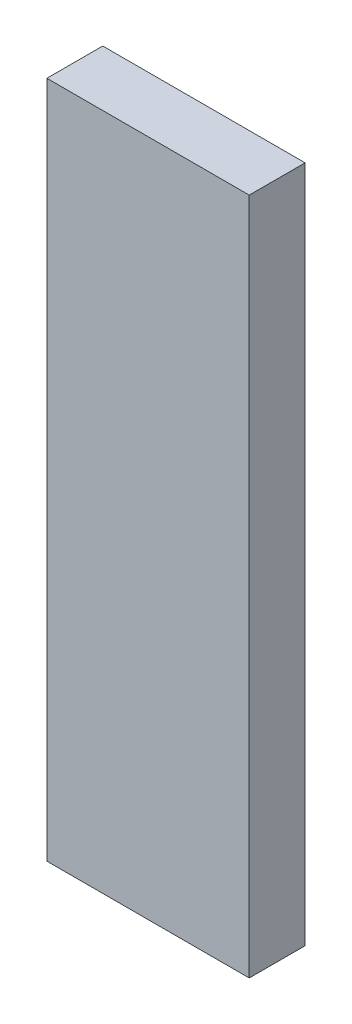
ISO-10303-21;
HEADER;
FILE_DESCRIPTION(('STEP AP214'),'2;1');
FILE_NAME('part.step','',(''),(''),'','','');
FILE_SCHEMA(('AUTOMOTIVE_DESIGN { 1 0 10303 214 1 1 1 1 }'));
ENDSEC;
DATA;
#1=APPLICATION_CONTEXT('core data for automotive mechanical design processes');
#2=APPLICATION_PROTOCOL_DEFINITION('international standard','automotive_design',2000,#1);
#3=PRODUCT_CONTEXT('',#1,'mechanical');
#4=PRODUCT('Part','Part','',(#3));
#5=PRODUCT_RELATED_PRODUCT_CATEGORY('part','',(#4));
#6=PRODUCT_DEFINITION_FORMATION('','',#4);
#7=PRODUCT_DEFINITION_CONTEXT('part definition',#1,'design');
#8=PRODUCT_DEFINITION('design','',#6,#7);
#9=PRODUCT_DEFINITION_SHAPE('','',#8);
#10=(LENGTH_UNIT() NAMED_UNIT(*) SI_UNIT(.MILLI.,.METRE.));
#11=(NAMED_UNIT(*) PLANE_ANGLE_UNIT() SI_UNIT($,.RADIAN.));
#12=(NAMED_UNIT(*) SI_UNIT($,.STERADIAN.) SOLID_ANGLE_UNIT());
#13=UNCERTAINTY_MEASURE_WITH_UNIT(LENGTH_MEASURE(1.E-05),#10,'distance_accuracy_value','');
#14=(GEOMETRIC_REPRESENTATION_CONTEXT(3) GLOBAL_UNCERTAINTY_ASSIGNED_CONTEXT((#13)) GLOBAL_UNIT_ASSIGNED_CONTEXT((#10,
#11,#12)) REPRESENTATION_CONTEXT('',''));
#15=CARTESIAN_POINT('',(0.,0.,0.));
#16=DIRECTION('',(0.,0.,1.));
#17=DIRECTION('',(1.,0.,0.));
#18=AXIS2_PLACEMENT_3D('',#15,#16,#17);
#19=CARTESIAN_POINT('',(-1.7018,-5.7023,0.9398));
#20=DIRECTION('',(1.,0.,0.));
#21=DIRECTION('',(0.,1.,0.));
#22=AXIS2_PLACEMENT_3D('',#19,#20,#21);
#23=PLANE('',#22);
#24=DIRECTION('',(0.,-1.,0.));
#25=VECTOR('',#24,1.);
#26=CARTESIAN_POINT('',(-1.7018,-5.7023,0.));
#27=LINE('',#26,#25);
#28=CARTESIAN_POINT('',(-1.7018,5.7023,0.));
#29=VERTEX_POINT('',#28);
#30=CARTESIAN_POINT('',(-1.7018,-5.7023,0.));
#31=VERTEX_POINT('',#30);
#32=EDGE_CURVE('E101',#29,#31,#27,.T.);
#33=ORIENTED_EDGE('',*,*,#32,.T.);
#34=DIRECTION('',(0.,0.,-1.));
#35=VECTOR('',#34,1.);
#36=CARTESIAN_POINT('',(-1.7018,-5.7023,0.9398));
#37=LINE('',#36,#35);
#38=CARTESIAN_POINT('',(-1.7018,-5.7023,0.9398));
#39=VERTEX_POINT('',#38);
#40=EDGE_CURVE('E11',#39,#31,#37,.T.);
#41=ORIENTED_EDGE('',*,*,#40,.F.);
#42=DIRECTION('',(0.,-1.,0.));
#43=VECTOR('',#42,1.);
#44=CARTESIAN_POINT('',(-1.7018,-5.7023,0.9398));
#45=LINE('',#44,#43);
#46=CARTESIAN_POINT('',(-1.7018,5.7023,0.9398));
#47=VERTEX_POINT('',#46);
#48=EDGE_CURVE('E89',#47,#39,#45,.T.);
#49=ORIENTED_EDGE('',*,*,#48,.F.);
#50=DIRECTION('',(0.,0.,-1.));
#51=VECTOR('',#50,1.);
#52=CARTESIAN_POINT('',(-1.7018,5.7023,0.9398));
#53=LINE('',#52,#51);
#54=EDGE_CURVE('E97',#47,#29,#53,.T.);
#55=ORIENTED_EDGE('',*,*,#54,.T.);
#56=EDGE_LOOP('',(#33,#41,#49,#55));
#57=FACE_BOUND('',#56,.T.);
#58=ADVANCED_FACE('F38',(#57),#23,.F.);
#59=CARTESIAN_POINT('',(-1.7018,-5.7023,0.9398));
#60=DIRECTION('',(0.,1.,0.));
#61=DIRECTION('',(0.,0.,1.));
#62=AXIS2_PLACEMENT_3D('',#59,#60,#61);
#63=PLANE('',#62);
#64=DIRECTION('',(1.,0.,0.));
#65=VECTOR('',#64,1.);
#66=CARTESIAN_POINT('',(-1.7018,-5.7023,0.));
#67=LINE('',#66,#65);
#68=CARTESIAN_POINT('',(1.7018,-5.7023,0.));
#69=VERTEX_POINT('',#68);
#70=EDGE_CURVE('E93',#31,#69,#67,.T.);
#71=ORIENTED_EDGE('',*,*,#70,.T.);
#72=DIRECTION('',(0.,0.,-1.));
#73=VECTOR('',#72,1.);
#74=CARTESIAN_POINT('',(1.7018,-5.7023,0.9398));
#75=LINE('',#74,#73);
#76=CARTESIAN_POINT('',(1.7018,-5.7023,0.9398));
#77=VERTEX_POINT('',#76);
#78=EDGE_CURVE('E46',#77,#69,#75,.T.);
#79=ORIENTED_EDGE('',*,*,#78,.F.);
#80=DIRECTION('',(1.,0.,0.));
#81=VECTOR('',#80,1.);
#82=CARTESIAN_POINT('',(-1.7018,-5.7023,0.9398));
#83=LINE('',#82,#81);
#84=EDGE_CURVE('E84',#39,#77,#83,.T.);
#85=ORIENTED_EDGE('',*,*,#84,.F.);
#86=ORIENTED_EDGE('',*,*,#40,.T.);
#87=EDGE_LOOP('',(#71,#79,#85,#86));
#88=FACE_BOUND('',#87,.T.);
#89=ADVANCED_FACE('F92',(#88),#63,.F.);
#90=CARTESIAN_POINT('',(1.7018,-5.7023,0.9398));
#91=DIRECTION('',(-1.,0.,0.));
#92=DIRECTION('',(0.,-1.,0.));
#93=AXIS2_PLACEMENT_3D('',#90,#91,#92);
#94=PLANE('',#93);
#95=DIRECTION('',(0.,1.,0.));
#96=VECTOR('',#95,1.);
#97=CARTESIAN_POINT('',(1.7018,-5.7023,0.));
#98=LINE('',#97,#96);
#99=CARTESIAN_POINT('',(1.7018,5.7023,0.));
#100=VERTEX_POINT('',#99);
#101=EDGE_CURVE('E71',#69,#100,#98,.T.);
#102=ORIENTED_EDGE('',*,*,#101,.T.);
#103=DIRECTION('',(0.,0.,-1.));
#104=VECTOR('',#103,1.);
#105=CARTESIAN_POINT('',(1.7018,5.7023,0.9398));
#106=LINE('',#105,#104);
#107=CARTESIAN_POINT('',(1.7018,5.7023,0.9398));
#108=VERTEX_POINT('',#107);
#109=EDGE_CURVE('E94',#108,#100,#106,.T.);
#110=ORIENTED_EDGE('',*,*,#109,.F.);
#111=DIRECTION('',(0.,1.,0.));
#112=VECTOR('',#111,1.);
#113=CARTESIAN_POINT('',(1.7018,-5.7023,0.9398));
#114=LINE('',#113,#112);
#115=EDGE_CURVE('E87',#77,#108,#114,.T.);
#116=ORIENTED_EDGE('',*,*,#115,.F.);
#117=ORIENTED_EDGE('',*,*,#78,.T.);
#118=EDGE_LOOP('',(#102,#110,#116,#117));
#119=FACE_BOUND('',#118,.T.);
#120=ADVANCED_FACE('F95',(#119),#94,.F.);
#121=CARTESIAN_POINT('',(-1.7018,5.7023,0.9398));
#122=DIRECTION('',(0.,-1.,0.));
#123=DIRECTION('',(1.,0.,0.));
#124=AXIS2_PLACEMENT_3D('',#121,#122,#123);
#125=PLANE('',#124);
#126=DIRECTION('',(-1.,0.,0.));
#127=VECTOR('',#126,1.);
#128=CARTESIAN_POINT('',(-1.7018,5.7023,0.));
#129=LINE('',#128,#127);
#130=EDGE_CURVE('E77',#100,#29,#129,.T.);
#131=ORIENTED_EDGE('',*,*,#130,.T.);
#132=ORIENTED_EDGE('',*,*,#54,.F.);
#133=DIRECTION('',(-1.,0.,0.));
#134=VECTOR('',#133,1.);
#135=CARTESIAN_POINT('',(-1.7018,5.7023,0.9398));
#136=LINE('',#135,#134);
#137=EDGE_CURVE('E54',#108,#47,#136,.T.);
#138=ORIENTED_EDGE('',*,*,#137,.F.);
#139=ORIENTED_EDGE('',*,*,#109,.T.);
#140=EDGE_LOOP('',(#131,#132,#138,#139));
#141=FACE_BOUND('',#140,.T.);
#142=ADVANCED_FACE('F108',(#141),#125,.F.);
#143=CARTESIAN_POINT('',(-1.7018,5.7023,0.9398));
#144=DIRECTION('',(0.,0.,-1.));
#145=DIRECTION('',(-1.,0.,0.));
#146=AXIS2_PLACEMENT_3D('',#143,#144,#145);
#147=PLANE('',#146);
#148=ORIENTED_EDGE('',*,*,#48,.T.);
#149=ORIENTED_EDGE('',*,*,#84,.T.);
#150=ORIENTED_EDGE('',*,*,#115,.T.);
#151=ORIENTED_EDGE('',*,*,#137,.T.);
#152=EDGE_LOOP('',(#148,#149,#150,#151));
#153=FACE_BOUND('',#152,.T.);
#154=ADVANCED_FACE('F85',(#153),#147,.F.);
#155=CARTESIAN_POINT('',(-1.7018,5.7023,0.));
#156=DIRECTION('',(0.,0.,-1.));
#157=DIRECTION('',(-1.,0.,0.));
#158=AXIS2_PLACEMENT_3D('',#155,#156,#157);
#159=PLANE('',#158);
#160=ORIENTED_EDGE('',*,*,#32,.F.);
#161=ORIENTED_EDGE('',*,*,#130,.F.);
#162=ORIENTED_EDGE('',*,*,#101,.F.);
#163=ORIENTED_EDGE('',*,*,#70,.F.);
#164=EDGE_LOOP('',(#160,#161,#162,#163));
#165=FACE_BOUND('',#164,.T.);
#166=ADVANCED_FACE('F111',(#165),#159,.T.);
#167=CLOSED_SHELL('',(#58,#89,#120,#142,#154,#166));
#168=MANIFOLD_SOLID_BREP('B2',#167);
#169=ADVANCED_BREP_SHAPE_REPRESENTATION('',(#18,#168),#14);
#170=SHAPE_DEFINITION_REPRESENTATION(#9,#169);
ENDSEC;
END-ISO-10303-21;
